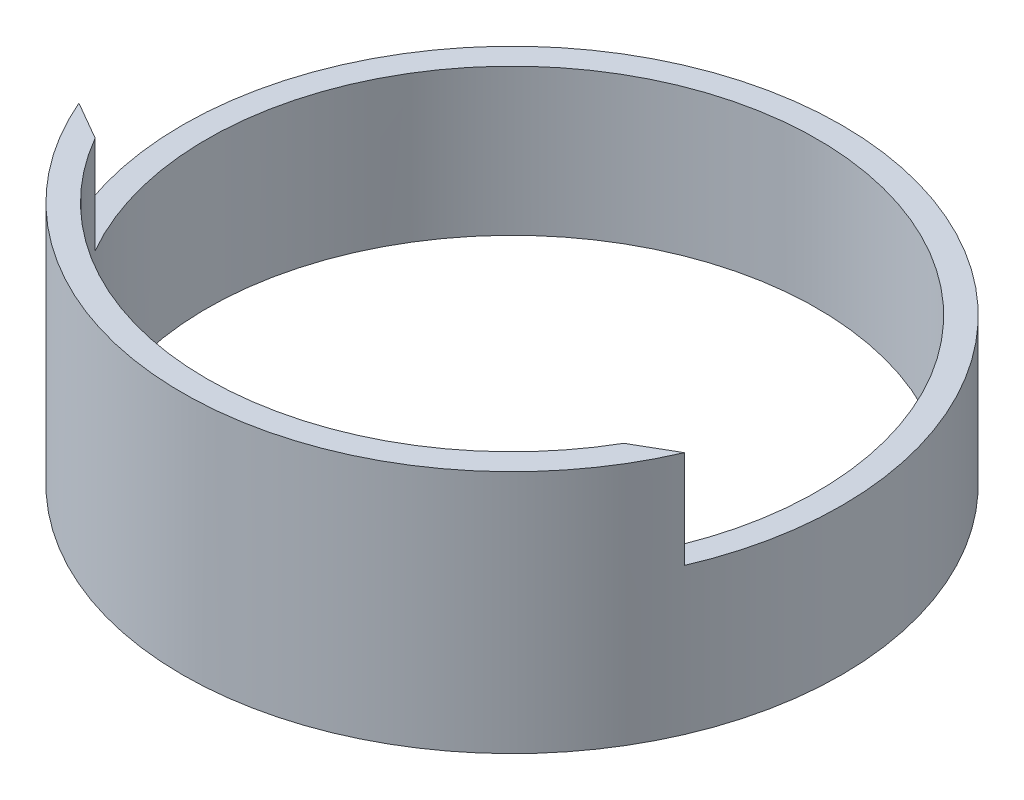
ISO-10303-21;
HEADER;
FILE_DESCRIPTION(('STEP AP214'),'2;1');
FILE_NAME('part.step','',(''),(''),'','','');
FILE_SCHEMA(('AUTOMOTIVE_DESIGN { 1 0 10303 214 1 1 1 1 }'));
ENDSEC;
DATA;
#1=APPLICATION_CONTEXT('core data for automotive mechanical design processes');
#2=APPLICATION_PROTOCOL_DEFINITION('international standard','automotive_design',2000,#1);
#3=PRODUCT_CONTEXT('',#1,'mechanical');
#4=PRODUCT('Part','Part','',(#3));
#5=PRODUCT_RELATED_PRODUCT_CATEGORY('part','',(#4));
#6=PRODUCT_DEFINITION_FORMATION('','',#4);
#7=PRODUCT_DEFINITION_CONTEXT('part definition',#1,'design');
#8=PRODUCT_DEFINITION('design','',#6,#7);
#9=PRODUCT_DEFINITION_SHAPE('','',#8);
#10=(LENGTH_UNIT() NAMED_UNIT(*) SI_UNIT(.MILLI.,.METRE.));
#11=(NAMED_UNIT(*) PLANE_ANGLE_UNIT() SI_UNIT($,.RADIAN.));
#12=(NAMED_UNIT(*) SI_UNIT($,.STERADIAN.) SOLID_ANGLE_UNIT());
#13=UNCERTAINTY_MEASURE_WITH_UNIT(LENGTH_MEASURE(1.E-05),#10,'distance_accuracy_value','');
#14=(GEOMETRIC_REPRESENTATION_CONTEXT(3) GLOBAL_UNCERTAINTY_ASSIGNED_CONTEXT((#13)) GLOBAL_UNIT_ASSIGNED_CONTEXT((#10,
#11,#12)) REPRESENTATION_CONTEXT('',''));
#15=CARTESIAN_POINT('',(0.,0.,0.));
#16=DIRECTION('',(0.,0.,1.));
#17=DIRECTION('',(1.,0.,0.));
#18=AXIS2_PLACEMENT_3D('',#15,#16,#17);
#19=CARTESIAN_POINT('',(0.,10.,0.));
#20=DIRECTION('',(0.,1.,0.));
#21=DIRECTION('',(0.,0.,1.));
#22=AXIS2_PLACEMENT_3D('',#19,#20,#21);
#23=PLANE('',#22);
#24=DIRECTION('',(0.866025403784438,0.,-0.500000000000001));
#25=VECTOR('',#24,1.);
#26=CARTESIAN_POINT('',(0.,10.,12.5));
#27=LINE('',#26,#25);
#28=CARTESIAN_POINT('',(10.8253175473055,10.,6.24999999999998));
#29=VERTEX_POINT('',#28);
#30=CARTESIAN_POINT('',(12.3981347774767,10.,5.34193354877456));
#31=VERTEX_POINT('',#30);
#32=EDGE_CURVE('E87',#29,#31,#27,.T.);
#33=ORIENTED_EDGE('',*,*,#32,.F.);
#34=CARTESIAN_POINT('',(0.,10.,0.));
#35=DIRECTION('',(0.,1.,0.));
#36=DIRECTION('',(0.,0.,1.));
#37=AXIS2_PLACEMENT_3D('',#34,#35,#36);
#38=CIRCLE('',#37,12.5);
#39=CARTESIAN_POINT('',(-10.8253175473055,10.,6.24999999999997));
#40=VERTEX_POINT('',#39);
#41=EDGE_CURVE('E86',#40,#29,#38,.T.);
#42=ORIENTED_EDGE('',*,*,#41,.F.);
#43=DIRECTION('',(0.866025403784438,0.,0.500000000000001));
#44=VECTOR('',#43,1.);
#45=CARTESIAN_POINT('',(-45.0333209967907,10.,-13.5));
#46=LINE('',#45,#44);
#47=CARTESIAN_POINT('',(-12.3981347774767,10.,5.34193354877455));
#48=VERTEX_POINT('',#47);
#49=EDGE_CURVE('E75',#48,#40,#46,.T.);
#50=ORIENTED_EDGE('',*,*,#49,.F.);
#51=CARTESIAN_POINT('',(0.,10.,0.));
#52=DIRECTION('',(0.,1.,0.));
#53=DIRECTION('',(0.,0.,1.));
#54=AXIS2_PLACEMENT_3D('',#51,#52,#53);
#55=CIRCLE('',#54,13.5);
#56=EDGE_CURVE('E84',#48,#31,#55,.T.);
#57=ORIENTED_EDGE('',*,*,#56,.T.);
#58=EDGE_LOOP('',(#33,#42,#50,#57));
#59=FACE_BOUND('',#58,.T.);
#60=ADVANCED_FACE('F33',(#59),#23,.T.);
#61=CARTESIAN_POINT('',(0.,0.,0.));
#62=DIRECTION('',(0.,1.,0.));
#63=DIRECTION('',(0.,0.,1.));
#64=AXIS2_PLACEMENT_3D('',#61,#62,#63);
#65=PLANE('',#64);
#66=CARTESIAN_POINT('',(0.,0.,0.));
#67=DIRECTION('',(0.,1.,0.));
#68=DIRECTION('',(0.,0.,1.));
#69=AXIS2_PLACEMENT_3D('',#66,#67,#68);
#70=CIRCLE('',#69,13.5);
#71=CARTESIAN_POINT('',(0.,0.,13.5));
#72=VERTEX_POINT('',#71);
#73=EDGE_CURVE('E92',#72,#72,#70,.T.);
#74=ORIENTED_EDGE('',*,*,#73,.F.);
#75=EDGE_LOOP('',(#74));
#76=FACE_BOUND('',#75,.T.);
#77=CARTESIAN_POINT('',(0.,0.,0.));
#78=DIRECTION('',(0.,1.,0.));
#79=DIRECTION('',(0.,0.,1.));
#80=AXIS2_PLACEMENT_3D('',#77,#78,#79);
#81=CIRCLE('',#80,12.5);
#82=CARTESIAN_POINT('',(0.,0.,12.5));
#83=VERTEX_POINT('',#82);
#84=EDGE_CURVE('E99',#83,#83,#81,.T.);
#85=ORIENTED_EDGE('',*,*,#84,.T.);
#86=EDGE_LOOP('',(#85));
#87=FACE_BOUND('',#86,.T.);
#88=ADVANCED_FACE('F118',(#76,#87),#65,.F.);
#89=CARTESIAN_POINT('',(0.,10.,0.));
#90=DIRECTION('',(0.,-1.,0.));
#91=DIRECTION('',(0.,0.,-1.));
#92=AXIS2_PLACEMENT_3D('',#89,#90,#91);
#93=CYLINDRICAL_SURFACE('',#92,13.5);
#94=CARTESIAN_POINT('',(0.,6.,0.));
#95=DIRECTION('',(0.,1.,0.));
#96=DIRECTION('',(0.,0.,1.));
#97=AXIS2_PLACEMENT_3D('',#94,#95,#96);
#98=CIRCLE('',#97,13.5);
#99=CARTESIAN_POINT('',(12.3981347774767,6.,5.34193354877456));
#100=VERTEX_POINT('',#99);
#101=CARTESIAN_POINT('',(-12.3981347774767,6.,5.34193354877455));
#102=VERTEX_POINT('',#101);
#103=EDGE_CURVE('E53',#100,#102,#98,.T.);
#104=ORIENTED_EDGE('',*,*,#103,.F.);
#105=DIRECTION('',(0.,-1.,0.));
#106=VECTOR('',#105,1.);
#107=CARTESIAN_POINT('',(12.3981347774767,10.,5.34193354877455));
#108=LINE('',#107,#106);
#109=EDGE_CURVE('E79',#100,#31,#108,.F.);
#110=ORIENTED_EDGE('',*,*,#109,.T.);
#111=ORIENTED_EDGE('',*,*,#56,.F.);
#112=DIRECTION('',(0.,-1.,0.));
#113=VECTOR('',#112,1.);
#114=CARTESIAN_POINT('',(-12.3981347774767,10.,5.34193354877456));
#115=LINE('',#114,#113);
#116=EDGE_CURVE('E72',#48,#102,#115,.T.);
#117=ORIENTED_EDGE('',*,*,#116,.T.);
#118=EDGE_LOOP('',(#104,#110,#111,#117));
#119=FACE_BOUND('',#118,.T.);
#120=ORIENTED_EDGE('',*,*,#73,.T.);
#121=EDGE_LOOP('',(#120));
#122=FACE_BOUND('',#121,.T.);
#123=ADVANCED_FACE('F35',(#119,#122),#93,.T.);
#124=CARTESIAN_POINT('',(0.,10.,0.));
#125=DIRECTION('',(0.,-1.,0.));
#126=DIRECTION('',(0.,0.,-1.));
#127=AXIS2_PLACEMENT_3D('',#124,#125,#126);
#128=CYLINDRICAL_SURFACE('',#127,12.5);
#129=DIRECTION('',(0.,-1.,0.));
#130=VECTOR('',#129,1.);
#131=CARTESIAN_POINT('',(-10.8253175473055,10.,6.24999999999998));
#132=LINE('',#131,#130);
#133=CARTESIAN_POINT('',(-10.8253175473055,6.,6.24999999999997));
#134=VERTEX_POINT('',#133);
#135=EDGE_CURVE('E41',#40,#134,#132,.T.);
#136=ORIENTED_EDGE('',*,*,#135,.F.);
#137=ORIENTED_EDGE('',*,*,#41,.T.);
#138=DIRECTION('',(0.,-1.,0.));
#139=VECTOR('',#138,1.);
#140=CARTESIAN_POINT('',(10.8253175473055,10.,6.24999999999997));
#141=LINE('',#140,#139);
#142=CARTESIAN_POINT('',(10.8253175473055,6.,6.24999999999998));
#143=VERTEX_POINT('',#142);
#144=EDGE_CURVE('E11',#143,#29,#141,.F.);
#145=ORIENTED_EDGE('',*,*,#144,.F.);
#146=CARTESIAN_POINT('',(0.,6.,0.));
#147=DIRECTION('',(0.,1.,0.));
#148=DIRECTION('',(0.,0.,1.));
#149=AXIS2_PLACEMENT_3D('',#146,#147,#148);
#150=CIRCLE('',#149,12.5);
#151=EDGE_CURVE('E91',#143,#134,#150,.T.);
#152=ORIENTED_EDGE('',*,*,#151,.T.);
#153=EDGE_LOOP('',(#136,#137,#145,#152));
#154=FACE_BOUND('',#153,.T.);
#155=ORIENTED_EDGE('',*,*,#84,.F.);
#156=EDGE_LOOP('',(#155));
#157=FACE_BOUND('',#156,.T.);
#158=ADVANCED_FACE('F103',(#154,#157),#128,.F.);
#159=CARTESIAN_POINT('',(0.,6.,12.5));
#160=DIRECTION('',(0.500000000000001,0.,0.866025403784438));
#161=DIRECTION('',(0.866025403784438,0.,-0.500000000000001));
#162=AXIS2_PLACEMENT_3D('',#159,#160,#161);
#163=PLANE('',#162);
#164=DIRECTION('',(0.866025403784438,0.,-0.500000000000001));
#165=VECTOR('',#164,1.);
#166=CARTESIAN_POINT('',(0.,6.,12.5));
#167=LINE('',#166,#165);
#168=EDGE_CURVE('E107',#143,#100,#167,.T.);
#169=ORIENTED_EDGE('',*,*,#168,.F.);
#170=ORIENTED_EDGE('',*,*,#144,.T.);
#171=ORIENTED_EDGE('',*,*,#32,.T.);
#172=ORIENTED_EDGE('',*,*,#109,.F.);
#173=EDGE_LOOP('',(#169,#170,#171,#172));
#174=FACE_BOUND('',#173,.T.);
#175=ADVANCED_FACE('F109',(#174),#163,.F.);
#176=CARTESIAN_POINT('',(-45.0333209967907,6.,-13.5));
#177=DIRECTION('',(-0.500000000000001,0.,0.866025403784438));
#178=DIRECTION('',(0.866025403784438,0.,0.500000000000001));
#179=AXIS2_PLACEMENT_3D('',#176,#177,#178);
#180=PLANE('',#179);
#181=ORIENTED_EDGE('',*,*,#49,.T.);
#182=ORIENTED_EDGE('',*,*,#135,.T.);
#183=DIRECTION('',(0.866025403784438,0.,0.500000000000001));
#184=VECTOR('',#183,1.);
#185=CARTESIAN_POINT('',(-45.0333209967907,6.,-13.5));
#186=LINE('',#185,#184);
#187=EDGE_CURVE('E48',#102,#134,#186,.T.);
#188=ORIENTED_EDGE('',*,*,#187,.F.);
#189=ORIENTED_EDGE('',*,*,#116,.F.);
#190=EDGE_LOOP('',(#181,#182,#188,#189));
#191=FACE_BOUND('',#190,.T.);
#192=ADVANCED_FACE('F74',(#191),#180,.F.);
#193=CARTESIAN_POINT('',(0.,6.,0.));
#194=DIRECTION('',(0.,1.,0.));
#195=DIRECTION('',(0.,0.,1.));
#196=AXIS2_PLACEMENT_3D('',#193,#194,#195);
#197=PLANE('',#196);
#198=ORIENTED_EDGE('',*,*,#103,.T.);
#199=ORIENTED_EDGE('',*,*,#187,.T.);
#200=ORIENTED_EDGE('',*,*,#151,.F.);
#201=ORIENTED_EDGE('',*,*,#168,.T.);
#202=EDGE_LOOP('',(#198,#199,#200,#201));
#203=FACE_BOUND('',#202,.T.);
#204=ADVANCED_FACE('F106',(#203),#197,.T.);
#205=CLOSED_SHELL('',(#60,#88,#123,#158,#175,#192,#204));
#206=MANIFOLD_SOLID_BREP('B2',#205);
#207=ADVANCED_BREP_SHAPE_REPRESENTATION('',(#18,#206),#14);
#208=SHAPE_DEFINITION_REPRESENTATION(#9,#207);
ENDSEC;
END-ISO-10303-21;
